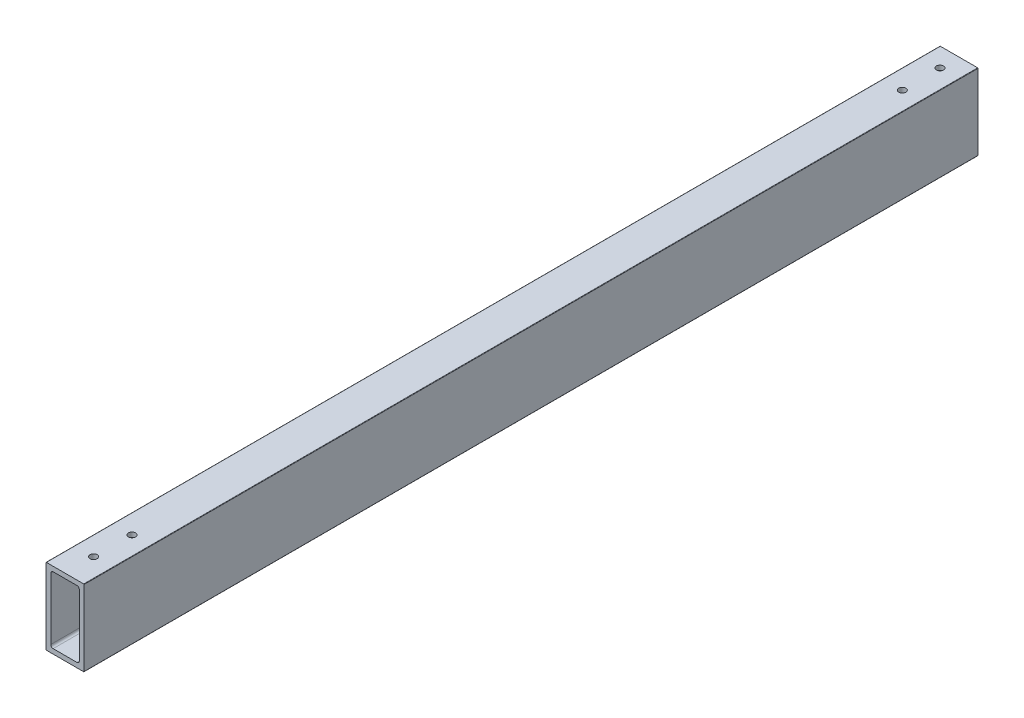
ISO-10303-21;
HEADER;
FILE_DESCRIPTION(('STEP AP214'),'2;1');
FILE_NAME('part.step','',(''),(''),'','','');
FILE_SCHEMA(('AUTOMOTIVE_DESIGN { 1 0 10303 214 1 1 1 1 }'));
ENDSEC;
DATA;
#1=APPLICATION_CONTEXT('core data for automotive mechanical design processes');
#2=APPLICATION_PROTOCOL_DEFINITION('international standard','automotive_design',2000,#1);
#3=PRODUCT_CONTEXT('',#1,'mechanical');
#4=PRODUCT('Part','Part','',(#3));
#5=PRODUCT_RELATED_PRODUCT_CATEGORY('part','',(#4));
#6=PRODUCT_DEFINITION_FORMATION('','',#4);
#7=PRODUCT_DEFINITION_CONTEXT('part definition',#1,'design');
#8=PRODUCT_DEFINITION('design','',#6,#7);
#9=PRODUCT_DEFINITION_SHAPE('','',#8);
#10=(LENGTH_UNIT() NAMED_UNIT(*) SI_UNIT(.MILLI.,.METRE.));
#11=(NAMED_UNIT(*) PLANE_ANGLE_UNIT() SI_UNIT($,.RADIAN.));
#12=(NAMED_UNIT(*) SI_UNIT($,.STERADIAN.) SOLID_ANGLE_UNIT());
#13=UNCERTAINTY_MEASURE_WITH_UNIT(LENGTH_MEASURE(1.E-05),#10,'distance_accuracy_value','');
#14=(GEOMETRIC_REPRESENTATION_CONTEXT(3) GLOBAL_UNCERTAINTY_ASSIGNED_CONTEXT((#13)) GLOBAL_UNIT_ASSIGNED_CONTEXT((#10,
#11,#12)) REPRESENTATION_CONTEXT('',''));
#15=CARTESIAN_POINT('',(0.,0.,0.));
#16=DIRECTION('',(0.,0.,1.));
#17=DIRECTION('',(1.,0.,0.));
#18=AXIS2_PLACEMENT_3D('',#15,#16,#17);
#19=CARTESIAN_POINT('',(3.175,4.7625,1828.8));
#20=DIRECTION('',(1.,0.,0.));
#21=DIRECTION('',(0.,1.,0.));
#22=AXIS2_PLACEMENT_3D('',#19,#20,#21);
#23=PLANE('',#22);
#24=DIRECTION('',(0.,0.,-1.));
#25=VECTOR('',#24,1.);
#26=CARTESIAN_POINT('',(3.175,4.7625,1828.8));
#27=LINE('',#26,#25);
#28=CARTESIAN_POINT('',(3.175,4.7625,603.25));
#29=VERTEX_POINT('',#28);
#30=CARTESIAN_POINT('',(3.175,4.7625,6.35000000000008));
#31=VERTEX_POINT('',#30);
#32=EDGE_CURVE('E184',#29,#31,#27,.T.);
#33=ORIENTED_EDGE('',*,*,#32,.T.);
#34=DIRECTION('',(0.,1.,0.));
#35=VECTOR('',#34,1.);
#36=CARTESIAN_POINT('',(3.175,4.7625,6.35000000000008));
#37=LINE('',#36,#35);
#38=CARTESIAN_POINT('',(3.175,46.0375,6.35000000000008));
#39=VERTEX_POINT('',#38);
#40=EDGE_CURVE('E57',#31,#39,#37,.T.);
#41=ORIENTED_EDGE('',*,*,#40,.T.);
#42=DIRECTION('',(0.,0.,-1.));
#43=VECTOR('',#42,1.);
#44=CARTESIAN_POINT('',(3.175,46.0375,1828.8));
#45=LINE('',#44,#43);
#46=CARTESIAN_POINT('',(3.175,46.0375,603.25));
#47=VERTEX_POINT('',#46);
#48=EDGE_CURVE('E198',#47,#39,#45,.T.);
#49=ORIENTED_EDGE('',*,*,#48,.F.);
#50=DIRECTION('',(0.,-1.,0.));
#51=VECTOR('',#50,1.);
#52=CARTESIAN_POINT('',(3.175,4.7625,603.25));
#53=LINE('',#52,#51);
#54=EDGE_CURVE('E178',#47,#29,#53,.T.);
#55=ORIENTED_EDGE('',*,*,#54,.T.);
#56=EDGE_LOOP('',(#33,#41,#49,#55));
#57=FACE_BOUND('',#56,.T.);
#58=ADVANCED_FACE('F42',(#57),#23,.T.);
#59=CARTESIAN_POINT('',(4.7625,46.0375,1828.8));
#60=DIRECTION('',(0.,0.,-1.));
#61=DIRECTION('',(-1.,0.,0.));
#62=AXIS2_PLACEMENT_3D('',#59,#60,#61);
#63=CYLINDRICAL_SURFACE('',#62,1.5875);
#64=CARTESIAN_POINT('',(4.7625,46.0375,6.35000000000008));
#65=DIRECTION('',(0.,0.,-1.));
#66=DIRECTION('',(-1.,0.,0.));
#67=AXIS2_PLACEMENT_3D('',#64,#65,#66);
#68=CIRCLE('',#67,1.5875);
#69=CARTESIAN_POINT('',(4.7625,47.625,6.35000000000008));
#70=VERTEX_POINT('',#69);
#71=EDGE_CURVE('E239',#70,#39,#68,.F.);
#72=ORIENTED_EDGE('',*,*,#71,.F.);
#73=DIRECTION('',(0.,0.,-1.));
#74=VECTOR('',#73,1.);
#75=CARTESIAN_POINT('',(4.7625,47.625,1828.8));
#76=LINE('',#75,#74);
#77=CARTESIAN_POINT('',(4.7625,47.625,603.25));
#78=VERTEX_POINT('',#77);
#79=EDGE_CURVE('E193',#78,#70,#76,.T.);
#80=ORIENTED_EDGE('',*,*,#79,.F.);
#81=CARTESIAN_POINT('',(4.7625,46.0375,603.25));
#82=DIRECTION('',(0.,0.,1.));
#83=DIRECTION('',(1.,0.,0.));
#84=AXIS2_PLACEMENT_3D('',#81,#82,#83);
#85=CIRCLE('',#84,1.5875);
#86=EDGE_CURVE('E300',#47,#78,#85,.F.);
#87=ORIENTED_EDGE('',*,*,#86,.F.);
#88=ORIENTED_EDGE('',*,*,#48,.T.);
#89=EDGE_LOOP('',(#72,#80,#87,#88));
#90=FACE_BOUND('',#89,.T.);
#91=ADVANCED_FACE('F325',(#90),#63,.F.);
#92=CARTESIAN_POINT('',(4.7625,47.625,1828.8));
#93=DIRECTION('',(0.,-1.,0.));
#94=DIRECTION('',(0.,0.,-1.));
#95=AXIS2_PLACEMENT_3D('',#92,#93,#94);
#96=PLANE('',#95);
#97=CARTESIAN_POINT('',(12.7,47.625,584.2));
#98=DIRECTION('',(0.,-1.,0.));
#99=DIRECTION('',(0.,0.,-1.));
#100=AXIS2_PLACEMENT_3D('',#97,#98,#99);
#101=CIRCLE('',#100,2.38125000000002);
#102=CARTESIAN_POINT('',(12.7,47.625,581.81875));
#103=VERTEX_POINT('',#102);
#104=EDGE_CURVE('E268',#103,#103,#101,.T.);
#105=ORIENTED_EDGE('',*,*,#104,.F.);
#106=EDGE_LOOP('',(#105));
#107=FACE_BOUND('',#106,.T.);
#108=CARTESIAN_POINT('',(12.954,47.625,558.8));
#109=DIRECTION('',(0.,-1.,0.));
#110=DIRECTION('',(0.,0.,-1.));
#111=AXIS2_PLACEMENT_3D('',#108,#109,#110);
#112=CIRCLE('',#111,2.38125000000002);
#113=CARTESIAN_POINT('',(12.954,47.625,556.41875));
#114=VERTEX_POINT('',#113);
#115=EDGE_CURVE('E265',#114,#114,#112,.T.);
#116=ORIENTED_EDGE('',*,*,#115,.F.);
#117=EDGE_LOOP('',(#116));
#118=FACE_BOUND('',#117,.T.);
#119=CARTESIAN_POINT('',(12.9539999999999,47.625,44.45));
#120=DIRECTION('',(0.,-1.,0.));
#121=DIRECTION('',(0.,0.,-1.));
#122=AXIS2_PLACEMENT_3D('',#119,#120,#121);
#123=CIRCLE('',#122,2.38125);
#124=CARTESIAN_POINT('',(12.9539999999999,47.625,42.06875));
#125=VERTEX_POINT('',#124);
#126=EDGE_CURVE('E262',#125,#125,#123,.T.);
#127=ORIENTED_EDGE('',*,*,#126,.F.);
#128=EDGE_LOOP('',(#127));
#129=FACE_BOUND('',#128,.T.);
#130=CARTESIAN_POINT('',(12.6999999999999,47.625,19.05));
#131=DIRECTION('',(0.,-1.,0.));
#132=DIRECTION('',(0.,0.,-1.));
#133=AXIS2_PLACEMENT_3D('',#130,#131,#132);
#134=CIRCLE('',#133,2.38125);
#135=CARTESIAN_POINT('',(12.6999999999999,47.625,16.66875));
#136=VERTEX_POINT('',#135);
#137=EDGE_CURVE('E251',#136,#136,#134,.T.);
#138=ORIENTED_EDGE('',*,*,#137,.F.);
#139=EDGE_LOOP('',(#138));
#140=FACE_BOUND('',#139,.T.);
#141=ORIENTED_EDGE('',*,*,#79,.T.);
#142=DIRECTION('',(1.,0.,0.));
#143=VECTOR('',#142,1.);
#144=CARTESIAN_POINT('',(4.7625,47.625,6.35000000000008));
#145=LINE('',#144,#143);
#146=CARTESIAN_POINT('',(20.6375,47.625,6.35000000000008));
#147=VERTEX_POINT('',#146);
#148=EDGE_CURVE('E237',#70,#147,#145,.T.);
#149=ORIENTED_EDGE('',*,*,#148,.T.);
#150=DIRECTION('',(0.,0.,-1.));
#151=VECTOR('',#150,1.);
#152=CARTESIAN_POINT('',(20.6375,47.625,1828.8));
#153=LINE('',#152,#151);
#154=CARTESIAN_POINT('',(20.6375,47.625,603.25));
#155=VERTEX_POINT('',#154);
#156=EDGE_CURVE('E190',#155,#147,#153,.T.);
#157=ORIENTED_EDGE('',*,*,#156,.F.);
#158=DIRECTION('',(-1.,0.,0.));
#159=VECTOR('',#158,1.);
#160=CARTESIAN_POINT('',(4.7625,47.625,603.25));
#161=LINE('',#160,#159);
#162=EDGE_CURVE('E297',#155,#78,#161,.T.);
#163=ORIENTED_EDGE('',*,*,#162,.T.);
#164=EDGE_LOOP('',(#141,#149,#157,#163));
#165=FACE_BOUND('',#164,.T.);
#166=ADVANCED_FACE('F324',(#107,#118,#129,#140,#165),#96,.T.);
#167=CARTESIAN_POINT('',(20.6375,46.0375,1828.8));
#168=DIRECTION('',(0.,0.,-1.));
#169=DIRECTION('',(-1.,0.,0.));
#170=AXIS2_PLACEMENT_3D('',#167,#168,#169);
#171=CYLINDRICAL_SURFACE('',#170,1.5875);
#172=CARTESIAN_POINT('',(20.6375,46.0375,6.35000000000008));
#173=DIRECTION('',(0.,0.,-1.));
#174=DIRECTION('',(-1.,0.,0.));
#175=AXIS2_PLACEMENT_3D('',#172,#173,#174);
#176=CIRCLE('',#175,1.5875);
#177=CARTESIAN_POINT('',(22.225,46.0375,6.35000000000008));
#178=VERTEX_POINT('',#177);
#179=EDGE_CURVE('E235',#178,#147,#176,.F.);
#180=ORIENTED_EDGE('',*,*,#179,.F.);
#181=DIRECTION('',(0.,0.,-1.));
#182=VECTOR('',#181,1.);
#183=CARTESIAN_POINT('',(22.225,46.0375,1828.8));
#184=LINE('',#183,#182);
#185=CARTESIAN_POINT('',(22.225,46.0375,603.25));
#186=VERTEX_POINT('',#185);
#187=EDGE_CURVE('E182',#186,#178,#184,.T.);
#188=ORIENTED_EDGE('',*,*,#187,.F.);
#189=CARTESIAN_POINT('',(20.6375,46.0375,603.25));
#190=DIRECTION('',(0.,0.,1.));
#191=DIRECTION('',(1.,0.,0.));
#192=AXIS2_PLACEMENT_3D('',#189,#190,#191);
#193=CIRCLE('',#192,1.5875);
#194=EDGE_CURVE('E233',#155,#186,#193,.F.);
#195=ORIENTED_EDGE('',*,*,#194,.F.);
#196=ORIENTED_EDGE('',*,*,#156,.T.);
#197=EDGE_LOOP('',(#180,#188,#195,#196));
#198=FACE_BOUND('',#197,.T.);
#199=ADVANCED_FACE('F232',(#198),#171,.F.);
#200=CARTESIAN_POINT('',(22.225,4.7625,1828.8));
#201=DIRECTION('',(-1.,0.,0.));
#202=DIRECTION('',(0.,0.,1.));
#203=AXIS2_PLACEMENT_3D('',#200,#201,#202);
#204=PLANE('',#203);
#205=ORIENTED_EDGE('',*,*,#187,.T.);
#206=DIRECTION('',(0.,-1.,0.));
#207=VECTOR('',#206,1.);
#208=CARTESIAN_POINT('',(22.225,4.7625,6.35000000000008));
#209=LINE('',#208,#207);
#210=CARTESIAN_POINT('',(22.225,4.7625,6.35000000000008));
#211=VERTEX_POINT('',#210);
#212=EDGE_CURVE('E227',#178,#211,#209,.T.);
#213=ORIENTED_EDGE('',*,*,#212,.T.);
#214=DIRECTION('',(0.,0.,-1.));
#215=VECTOR('',#214,1.);
#216=CARTESIAN_POINT('',(22.225,4.7625,1828.8));
#217=LINE('',#216,#215);
#218=CARTESIAN_POINT('',(22.225,4.7625,603.25));
#219=VERTEX_POINT('',#218);
#220=EDGE_CURVE('E216',#219,#211,#217,.T.);
#221=ORIENTED_EDGE('',*,*,#220,.F.);
#222=DIRECTION('',(0.,1.,0.));
#223=VECTOR('',#222,1.);
#224=CARTESIAN_POINT('',(22.225,4.7625,603.25));
#225=LINE('',#224,#223);
#226=EDGE_CURVE('E228',#219,#186,#225,.T.);
#227=ORIENTED_EDGE('',*,*,#226,.T.);
#228=EDGE_LOOP('',(#205,#213,#221,#227));
#229=FACE_BOUND('',#228,.T.);
#230=ADVANCED_FACE('F44',(#229),#204,.T.);
#231=CARTESIAN_POINT('',(20.6375,4.7625,1828.8));
#232=DIRECTION('',(0.,0.,-1.));
#233=DIRECTION('',(-1.,0.,0.));
#234=AXIS2_PLACEMENT_3D('',#231,#232,#233);
#235=CYLINDRICAL_SURFACE('',#234,1.5875);
#236=CARTESIAN_POINT('',(20.6375,4.7625,6.35000000000008));
#237=DIRECTION('',(0.,0.,-1.));
#238=DIRECTION('',(-1.,0.,0.));
#239=AXIS2_PLACEMENT_3D('',#236,#237,#238);
#240=CIRCLE('',#239,1.5875);
#241=CARTESIAN_POINT('',(20.6375,3.175,6.35000000000008));
#242=VERTEX_POINT('',#241);
#243=EDGE_CURVE('E241',#242,#211,#240,.F.);
#244=ORIENTED_EDGE('',*,*,#243,.F.);
#245=DIRECTION('',(0.,0.,-1.));
#246=VECTOR('',#245,1.);
#247=CARTESIAN_POINT('',(20.6375,3.175,1828.8));
#248=LINE('',#247,#246);
#249=CARTESIAN_POINT('',(20.6375,3.175,603.25));
#250=VERTEX_POINT('',#249);
#251=EDGE_CURVE('E214',#250,#242,#248,.T.);
#252=ORIENTED_EDGE('',*,*,#251,.F.);
#253=CARTESIAN_POINT('',(20.6375,4.7625,603.25));
#254=DIRECTION('',(0.,0.,1.));
#255=DIRECTION('',(1.,0.,0.));
#256=AXIS2_PLACEMENT_3D('',#253,#254,#255);
#257=CIRCLE('',#256,1.5875);
#258=EDGE_CURVE('E293',#219,#250,#257,.F.);
#259=ORIENTED_EDGE('',*,*,#258,.F.);
#260=ORIENTED_EDGE('',*,*,#220,.T.);
#261=EDGE_LOOP('',(#244,#252,#259,#260));
#262=FACE_BOUND('',#261,.T.);
#263=ADVANCED_FACE('F316',(#262),#235,.F.);
#264=CARTESIAN_POINT('',(4.7625,3.175,1828.8));
#265=DIRECTION('',(0.,1.,0.));
#266=DIRECTION('',(1.,0.,0.));
#267=AXIS2_PLACEMENT_3D('',#264,#265,#266);
#268=PLANE('',#267);
#269=ORIENTED_EDGE('',*,*,#251,.T.);
#270=DIRECTION('',(-1.,0.,0.));
#271=VECTOR('',#270,1.);
#272=CARTESIAN_POINT('',(4.7625,3.175,6.35000000000008));
#273=LINE('',#272,#271);
#274=CARTESIAN_POINT('',(4.7625,3.175,6.35000000000008));
#275=VERTEX_POINT('',#274);
#276=EDGE_CURVE('E311',#242,#275,#273,.T.);
#277=ORIENTED_EDGE('',*,*,#276,.T.);
#278=DIRECTION('',(0.,0.,-1.));
#279=VECTOR('',#278,1.);
#280=CARTESIAN_POINT('',(4.7625,3.175,1828.8));
#281=LINE('',#280,#279);
#282=CARTESIAN_POINT('',(4.7625,3.175,603.25));
#283=VERTEX_POINT('',#282);
#284=EDGE_CURVE('E211',#283,#275,#281,.T.);
#285=ORIENTED_EDGE('',*,*,#284,.F.);
#286=DIRECTION('',(1.,0.,0.));
#287=VECTOR('',#286,1.);
#288=CARTESIAN_POINT('',(4.7625,3.175,603.25));
#289=LINE('',#288,#287);
#290=EDGE_CURVE('E290',#283,#250,#289,.T.);
#291=ORIENTED_EDGE('',*,*,#290,.T.);
#292=EDGE_LOOP('',(#269,#277,#285,#291));
#293=FACE_BOUND('',#292,.T.);
#294=ADVANCED_FACE('F318',(#293),#268,.T.);
#295=CARTESIAN_POINT('',(4.7625,4.7625,1828.8));
#296=DIRECTION('',(0.,0.,-1.));
#297=DIRECTION('',(-1.,0.,0.));
#298=AXIS2_PLACEMENT_3D('',#295,#296,#297);
#299=CYLINDRICAL_SURFACE('',#298,1.5875);
#300=CARTESIAN_POINT('',(4.7625,4.7625,6.35000000000008));
#301=DIRECTION('',(0.,0.,-1.));
#302=DIRECTION('',(-1.,0.,0.));
#303=AXIS2_PLACEMENT_3D('',#300,#301,#302);
#304=CIRCLE('',#303,1.5875);
#305=EDGE_CURVE('E167',#31,#275,#304,.F.);
#306=ORIENTED_EDGE('',*,*,#305,.F.);
#307=ORIENTED_EDGE('',*,*,#32,.F.);
#308=CARTESIAN_POINT('',(4.7625,4.7625,603.25));
#309=DIRECTION('',(0.,0.,1.));
#310=DIRECTION('',(1.,0.,0.));
#311=AXIS2_PLACEMENT_3D('',#308,#309,#310);
#312=CIRCLE('',#311,1.5875);
#313=EDGE_CURVE('E288',#283,#29,#312,.F.);
#314=ORIENTED_EDGE('',*,*,#313,.F.);
#315=ORIENTED_EDGE('',*,*,#284,.T.);
#316=EDGE_LOOP('',(#306,#307,#314,#315));
#317=FACE_BOUND('',#316,.T.);
#318=ADVANCED_FACE('F308',(#317),#299,.F.);
#319=CARTESIAN_POINT('',(0.,0.254,1828.8));
#320=DIRECTION('',(1.,0.,0.));
#321=DIRECTION('',(0.,1.,0.));
#322=AXIS2_PLACEMENT_3D('',#319,#320,#321);
#323=PLANE('',#322);
#324=DIRECTION('',(0.,1.,0.));
#325=VECTOR('',#324,1.);
#326=CARTESIAN_POINT('',(0.,0.254,6.35000000000008));
#327=LINE('',#326,#325);
#328=CARTESIAN_POINT('',(0.,0.254,6.35000000000008));
#329=VERTEX_POINT('',#328);
#330=CARTESIAN_POINT('',(0.,50.546,6.35000000000008));
#331=VERTEX_POINT('',#330);
#332=EDGE_CURVE('E153',#329,#331,#327,.T.);
#333=ORIENTED_EDGE('',*,*,#332,.F.);
#334=DIRECTION('',(0.,0.,-1.));
#335=VECTOR('',#334,1.);
#336=CARTESIAN_POINT('',(0.,0.254,1828.8));
#337=LINE('',#336,#335);
#338=CARTESIAN_POINT('',(0.,0.254,603.25));
#339=VERTEX_POINT('',#338);
#340=EDGE_CURVE('E164',#339,#329,#337,.T.);
#341=ORIENTED_EDGE('',*,*,#340,.F.);
#342=DIRECTION('',(0.,-1.,0.));
#343=VECTOR('',#342,1.);
#344=CARTESIAN_POINT('',(0.,0.254,603.25));
#345=LINE('',#344,#343);
#346=CARTESIAN_POINT('',(0.,50.546,603.25));
#347=VERTEX_POINT('',#346);
#348=EDGE_CURVE('E286',#347,#339,#345,.T.);
#349=ORIENTED_EDGE('',*,*,#348,.F.);
#350=DIRECTION('',(0.,0.,-1.));
#351=VECTOR('',#350,1.);
#352=CARTESIAN_POINT('',(0.,50.546,1828.8));
#353=LINE('',#352,#351);
#354=EDGE_CURVE('E166',#347,#331,#353,.T.);
#355=ORIENTED_EDGE('',*,*,#354,.T.);
#356=EDGE_LOOP('',(#333,#341,#349,#355));
#357=FACE_BOUND('',#356,.T.);
#358=ADVANCED_FACE('F162',(#357),#323,.F.);
#359=CARTESIAN_POINT('',(0.254,50.546,1828.8));
#360=DIRECTION('',(0.,0.,-1.));
#361=DIRECTION('',(-1.,0.,0.));
#362=AXIS2_PLACEMENT_3D('',#359,#360,#361);
#363=CYLINDRICAL_SURFACE('',#362,0.253999999999995);
#364=DIRECTION('',(0.,0.,-1.));
#365=VECTOR('',#364,1.);
#366=CARTESIAN_POINT('',(0.254,50.8,1828.8));
#367=LINE('',#366,#365);
#368=CARTESIAN_POINT('',(0.254,50.8,603.25));
#369=VERTEX_POINT('',#368);
#370=CARTESIAN_POINT('',(0.254,50.8,6.35000000000008));
#371=VERTEX_POINT('',#370);
#372=EDGE_CURVE('E185',#369,#371,#367,.T.);
#373=ORIENTED_EDGE('',*,*,#372,.T.);
#374=CARTESIAN_POINT('',(0.254,50.546,6.35000000000008));
#375=DIRECTION('',(0.,0.,-1.));
#376=DIRECTION('',(-1.,0.,0.));
#377=AXIS2_PLACEMENT_3D('',#374,#375,#376);
#378=CIRCLE('',#377,0.253999999999995);
#379=EDGE_CURVE('E168',#371,#331,#378,.F.);
#380=ORIENTED_EDGE('',*,*,#379,.T.);
#381=ORIENTED_EDGE('',*,*,#354,.F.);
#382=CARTESIAN_POINT('',(0.254,50.546,603.25));
#383=DIRECTION('',(0.,0.,1.));
#384=DIRECTION('',(1.,0.,0.));
#385=AXIS2_PLACEMENT_3D('',#382,#383,#384);
#386=CIRCLE('',#385,0.253999999999995);
#387=EDGE_CURVE('E283',#347,#369,#386,.F.);
#388=ORIENTED_EDGE('',*,*,#387,.T.);
#389=EDGE_LOOP('',(#373,#380,#381,#388));
#390=FACE_BOUND('',#389,.T.);
#391=ADVANCED_FACE('F344',(#390),#363,.T.);
#392=CARTESIAN_POINT('',(0.254,50.8,1828.8));
#393=DIRECTION('',(0.,-1.,0.));
#394=DIRECTION('',(0.,0.,-1.));
#395=AXIS2_PLACEMENT_3D('',#392,#393,#394);
#396=PLANE('',#395);
#397=CARTESIAN_POINT('',(12.6999999999999,50.8,19.05));
#398=DIRECTION('',(0.,1.,0.));
#399=DIRECTION('',(0.,0.,-1.));
#400=AXIS2_PLACEMENT_3D('',#397,#398,#399);
#401=CIRCLE('',#400,2.38125);
#402=CARTESIAN_POINT('',(12.6999999999999,50.8,16.66875));
#403=VERTEX_POINT('',#402);
#404=EDGE_CURVE('E247',#403,#403,#401,.T.);
#405=ORIENTED_EDGE('',*,*,#404,.F.);
#406=EDGE_LOOP('',(#405));
#407=FACE_BOUND('',#406,.T.);
#408=CARTESIAN_POINT('',(12.9539999999999,50.8,44.45));
#409=DIRECTION('',(0.,1.,0.));
#410=DIRECTION('',(0.,0.,-1.));
#411=AXIS2_PLACEMENT_3D('',#408,#409,#410);
#412=CIRCLE('',#411,2.38125);
#413=CARTESIAN_POINT('',(12.9539999999999,50.8,42.06875));
#414=VERTEX_POINT('',#413);
#415=EDGE_CURVE('E255',#414,#414,#412,.T.);
#416=ORIENTED_EDGE('',*,*,#415,.F.);
#417=EDGE_LOOP('',(#416));
#418=FACE_BOUND('',#417,.T.);
#419=CARTESIAN_POINT('',(12.954,50.8,558.8));
#420=DIRECTION('',(0.,1.,0.));
#421=DIRECTION('',(0.,0.,1.));
#422=AXIS2_PLACEMENT_3D('',#419,#420,#421);
#423=CIRCLE('',#422,2.38125000000002);
#424=CARTESIAN_POINT('',(12.954,50.8,561.18125));
#425=VERTEX_POINT('',#424);
#426=EDGE_CURVE('E252',#425,#425,#423,.T.);
#427=ORIENTED_EDGE('',*,*,#426,.F.);
#428=EDGE_LOOP('',(#427));
#429=FACE_BOUND('',#428,.T.);
#430=CARTESIAN_POINT('',(12.7,50.8,584.2));
#431=DIRECTION('',(0.,1.,0.));
#432=DIRECTION('',(0.,0.,1.));
#433=AXIS2_PLACEMENT_3D('',#430,#431,#432);
#434=CIRCLE('',#433,2.38125000000002);
#435=CARTESIAN_POINT('',(12.7,50.8,586.58125));
#436=VERTEX_POINT('',#435);
#437=EDGE_CURVE('E248',#436,#436,#434,.T.);
#438=ORIENTED_EDGE('',*,*,#437,.F.);
#439=EDGE_LOOP('',(#438));
#440=FACE_BOUND('',#439,.T.);
#441=DIRECTION('',(1.,0.,0.));
#442=VECTOR('',#441,1.);
#443=CARTESIAN_POINT('',(0.254,50.8,6.35000000000008));
#444=LINE('',#443,#442);
#445=CARTESIAN_POINT('',(25.146,50.8,6.35000000000008));
#446=VERTEX_POINT('',#445);
#447=EDGE_CURVE('E365',#371,#446,#444,.T.);
#448=ORIENTED_EDGE('',*,*,#447,.F.);
#449=ORIENTED_EDGE('',*,*,#372,.F.);
#450=DIRECTION('',(-1.,0.,0.));
#451=VECTOR('',#450,1.);
#452=CARTESIAN_POINT('',(0.254,50.8,603.25));
#453=LINE('',#452,#451);
#454=CARTESIAN_POINT('',(25.146,50.8,603.25));
#455=VERTEX_POINT('',#454);
#456=EDGE_CURVE('E281',#455,#369,#453,.T.);
#457=ORIENTED_EDGE('',*,*,#456,.F.);
#458=DIRECTION('',(0.,0.,-1.));
#459=VECTOR('',#458,1.);
#460=CARTESIAN_POINT('',(25.146,50.8,1828.8));
#461=LINE('',#460,#459);
#462=EDGE_CURVE('E189',#455,#446,#461,.T.);
#463=ORIENTED_EDGE('',*,*,#462,.T.);
#464=EDGE_LOOP('',(#448,#449,#457,#463));
#465=FACE_BOUND('',#464,.T.);
#466=ADVANCED_FACE('F346',(#407,#418,#429,#440,#465),#396,.F.);
#467=CARTESIAN_POINT('',(25.146,50.546,1828.8));
#468=DIRECTION('',(0.,0.,-1.));
#469=DIRECTION('',(-1.,0.,0.));
#470=AXIS2_PLACEMENT_3D('',#467,#468,#469);
#471=CYLINDRICAL_SURFACE('',#470,0.253999999999994);
#472=DIRECTION('',(0.,0.,-1.));
#473=VECTOR('',#472,1.);
#474=CARTESIAN_POINT('',(25.4,50.546,1828.8));
#475=LINE('',#474,#473);
#476=CARTESIAN_POINT('',(25.4,50.546,603.25));
#477=VERTEX_POINT('',#476);
#478=CARTESIAN_POINT('',(25.4,50.546,6.35000000000008));
#479=VERTEX_POINT('',#478);
#480=EDGE_CURVE('E194',#477,#479,#475,.T.);
#481=ORIENTED_EDGE('',*,*,#480,.T.);
#482=CARTESIAN_POINT('',(25.146,50.546,6.35000000000008));
#483=DIRECTION('',(0.,0.,-1.));
#484=DIRECTION('',(-1.,0.,0.));
#485=AXIS2_PLACEMENT_3D('',#482,#483,#484);
#486=CIRCLE('',#485,0.253999999999994);
#487=EDGE_CURVE('E369',#479,#446,#486,.F.);
#488=ORIENTED_EDGE('',*,*,#487,.T.);
#489=ORIENTED_EDGE('',*,*,#462,.F.);
#490=CARTESIAN_POINT('',(25.146,50.546,603.25));
#491=DIRECTION('',(0.,0.,1.));
#492=DIRECTION('',(1.,0.,0.));
#493=AXIS2_PLACEMENT_3D('',#490,#491,#492);
#494=CIRCLE('',#493,0.253999999999994);
#495=EDGE_CURVE('E278',#455,#477,#494,.F.);
#496=ORIENTED_EDGE('',*,*,#495,.T.);
#497=EDGE_LOOP('',(#481,#488,#489,#496));
#498=FACE_BOUND('',#497,.T.);
#499=ADVANCED_FACE('F349',(#498),#471,.T.);
#500=CARTESIAN_POINT('',(25.4,0.254,1828.8));
#501=DIRECTION('',(-1.,0.,0.));
#502=DIRECTION('',(0.,0.,1.));
#503=AXIS2_PLACEMENT_3D('',#500,#501,#502);
#504=PLANE('',#503);
#505=DIRECTION('',(0.,-1.,0.));
#506=VECTOR('',#505,1.);
#507=CARTESIAN_POINT('',(25.4,0.254,6.35000000000008));
#508=LINE('',#507,#506);
#509=CARTESIAN_POINT('',(25.4,0.254,6.35000000000008));
#510=VERTEX_POINT('',#509);
#511=EDGE_CURVE('E373',#479,#510,#508,.T.);
#512=ORIENTED_EDGE('',*,*,#511,.F.);
#513=ORIENTED_EDGE('',*,*,#480,.F.);
#514=DIRECTION('',(0.,1.,0.));
#515=VECTOR('',#514,1.);
#516=CARTESIAN_POINT('',(25.4,0.254,603.25));
#517=LINE('',#516,#515);
#518=CARTESIAN_POINT('',(25.4,0.254,603.25));
#519=VERTEX_POINT('',#518);
#520=EDGE_CURVE('E276',#519,#477,#517,.T.);
#521=ORIENTED_EDGE('',*,*,#520,.F.);
#522=DIRECTION('',(0.,0.,-1.));
#523=VECTOR('',#522,1.);
#524=CARTESIAN_POINT('',(25.4,0.254,1828.8));
#525=LINE('',#524,#523);
#526=EDGE_CURVE('E176',#519,#510,#525,.T.);
#527=ORIENTED_EDGE('',*,*,#526,.T.);
#528=EDGE_LOOP('',(#512,#513,#521,#527));
#529=FACE_BOUND('',#528,.T.);
#530=ADVANCED_FACE('F342',(#529),#504,.F.);
#531=CARTESIAN_POINT('',(25.146,0.254,1828.8));
#532=DIRECTION('',(0.,0.,-1.));
#533=DIRECTION('',(-1.,0.,0.));
#534=AXIS2_PLACEMENT_3D('',#531,#532,#533);
#535=CYLINDRICAL_SURFACE('',#534,0.254);
#536=DIRECTION('',(0.,0.,-1.));
#537=VECTOR('',#536,1.);
#538=CARTESIAN_POINT('',(25.146,0.,1828.8));
#539=LINE('',#538,#537);
#540=CARTESIAN_POINT('',(25.146,0.,603.25));
#541=VERTEX_POINT('',#540);
#542=CARTESIAN_POINT('',(25.146,0.,6.35000000000008));
#543=VERTEX_POINT('',#542);
#544=EDGE_CURVE('E172',#541,#543,#539,.T.);
#545=ORIENTED_EDGE('',*,*,#544,.T.);
#546=CARTESIAN_POINT('',(25.146,0.254,6.35000000000008));
#547=DIRECTION('',(0.,0.,-1.));
#548=DIRECTION('',(-1.,0.,0.));
#549=AXIS2_PLACEMENT_3D('',#546,#547,#548);
#550=CIRCLE('',#549,0.254);
#551=EDGE_CURVE('E375',#543,#510,#550,.F.);
#552=ORIENTED_EDGE('',*,*,#551,.T.);
#553=ORIENTED_EDGE('',*,*,#526,.F.);
#554=CARTESIAN_POINT('',(25.146,0.254,603.25));
#555=DIRECTION('',(0.,0.,1.));
#556=DIRECTION('',(1.,0.,0.));
#557=AXIS2_PLACEMENT_3D('',#554,#555,#556);
#558=CIRCLE('',#557,0.254);
#559=EDGE_CURVE('E273',#519,#541,#558,.F.);
#560=ORIENTED_EDGE('',*,*,#559,.T.);
#561=EDGE_LOOP('',(#545,#552,#553,#560));
#562=FACE_BOUND('',#561,.T.);
#563=ADVANCED_FACE('F338',(#562),#535,.T.);
#564=CARTESIAN_POINT('',(0.254,0.,1828.8));
#565=DIRECTION('',(0.,1.,0.));
#566=DIRECTION('',(1.,0.,0.));
#567=AXIS2_PLACEMENT_3D('',#564,#565,#566);
#568=PLANE('',#567);
#569=DIRECTION('',(-1.,0.,0.));
#570=VECTOR('',#569,1.);
#571=CARTESIAN_POINT('',(0.254,0.,6.35000000000008));
#572=LINE('',#571,#570);
#573=CARTESIAN_POINT('',(0.254,0.,6.35000000000008));
#574=VERTEX_POINT('',#573);
#575=EDGE_CURVE('E65',#543,#574,#572,.T.);
#576=ORIENTED_EDGE('',*,*,#575,.F.);
#577=ORIENTED_EDGE('',*,*,#544,.F.);
#578=DIRECTION('',(1.,0.,0.));
#579=VECTOR('',#578,1.);
#580=CARTESIAN_POINT('',(0.254,0.,603.25));
#581=LINE('',#580,#579);
#582=CARTESIAN_POINT('',(0.254,0.,603.25));
#583=VERTEX_POINT('',#582);
#584=EDGE_CURVE('E271',#583,#541,#581,.T.);
#585=ORIENTED_EDGE('',*,*,#584,.F.);
#586=DIRECTION('',(0.,0.,-1.));
#587=VECTOR('',#586,1.);
#588=CARTESIAN_POINT('',(0.254,0.,1828.8));
#589=LINE('',#588,#587);
#590=EDGE_CURVE('E173',#583,#574,#589,.T.);
#591=ORIENTED_EDGE('',*,*,#590,.T.);
#592=EDGE_LOOP('',(#576,#577,#585,#591));
#593=FACE_BOUND('',#592,.T.);
#594=ADVANCED_FACE('F341',(#593),#568,.F.);
#595=CARTESIAN_POINT('',(0.254,0.254,1828.8));
#596=DIRECTION('',(0.,0.,-1.));
#597=DIRECTION('',(-1.,0.,0.));
#598=AXIS2_PLACEMENT_3D('',#595,#596,#597);
#599=CYLINDRICAL_SURFACE('',#598,0.254);
#600=ORIENTED_EDGE('',*,*,#340,.T.);
#601=CARTESIAN_POINT('',(0.254,0.254,6.35000000000008));
#602=DIRECTION('',(0.,0.,-1.));
#603=DIRECTION('',(-1.,0.,0.));
#604=AXIS2_PLACEMENT_3D('',#601,#602,#603);
#605=CIRCLE('',#604,0.254);
#606=EDGE_CURVE('E11',#329,#574,#605,.F.);
#607=ORIENTED_EDGE('',*,*,#606,.T.);
#608=ORIENTED_EDGE('',*,*,#590,.F.);
#609=CARTESIAN_POINT('',(0.254,0.254,603.25));
#610=DIRECTION('',(0.,0.,1.));
#611=DIRECTION('',(1.,0.,0.));
#612=AXIS2_PLACEMENT_3D('',#609,#610,#611);
#613=CIRCLE('',#612,0.254);
#614=EDGE_CURVE('E50',#583,#339,#613,.F.);
#615=ORIENTED_EDGE('',*,*,#614,.T.);
#616=EDGE_LOOP('',(#600,#607,#608,#615));
#617=FACE_BOUND('',#616,.T.);
#618=ADVANCED_FACE('F171',(#617),#599,.T.);
#619=CARTESIAN_POINT('',(0.,0.,603.25));
#620=DIRECTION('',(0.,0.,1.));
#621=DIRECTION('',(1.,0.,0.));
#622=AXIS2_PLACEMENT_3D('',#619,#620,#621);
#623=PLANE('',#622);
#624=ORIENTED_EDGE('',*,*,#86,.T.);
#625=ORIENTED_EDGE('',*,*,#162,.F.);
#626=ORIENTED_EDGE('',*,*,#194,.T.);
#627=ORIENTED_EDGE('',*,*,#226,.F.);
#628=ORIENTED_EDGE('',*,*,#258,.T.);
#629=ORIENTED_EDGE('',*,*,#290,.F.);
#630=ORIENTED_EDGE('',*,*,#313,.T.);
#631=ORIENTED_EDGE('',*,*,#54,.F.);
#632=EDGE_LOOP('',(#624,#625,#626,#627,#628,#629,#630,#631));
#633=FACE_BOUND('',#632,.T.);
#634=ORIENTED_EDGE('',*,*,#348,.T.);
#635=ORIENTED_EDGE('',*,*,#614,.F.);
#636=ORIENTED_EDGE('',*,*,#584,.T.);
#637=ORIENTED_EDGE('',*,*,#559,.F.);
#638=ORIENTED_EDGE('',*,*,#520,.T.);
#639=ORIENTED_EDGE('',*,*,#495,.F.);
#640=ORIENTED_EDGE('',*,*,#456,.T.);
#641=ORIENTED_EDGE('',*,*,#387,.F.);
#642=EDGE_LOOP('',(#634,#635,#636,#637,#638,#639,#640,#641));
#643=FACE_BOUND('',#642,.T.);
#644=ADVANCED_FACE('F320',(#633,#643),#623,.T.);
#645=CARTESIAN_POINT('',(12.6999999999999,36.83,19.05));
#646=DIRECTION('',(0.,1.,0.));
#647=DIRECTION('',(0.,0.,1.));
#648=AXIS2_PLACEMENT_3D('',#645,#646,#647);
#649=CYLINDRICAL_SURFACE('',#648,2.38125);
#650=ORIENTED_EDGE('',*,*,#137,.T.);
#651=EDGE_LOOP('',(#650));
#652=FACE_BOUND('',#651,.T.);
#653=ORIENTED_EDGE('',*,*,#404,.T.);
#654=EDGE_LOOP('',(#653));
#655=FACE_BOUND('',#654,.T.);
#656=ADVANCED_FACE('F458',(#652,#655),#649,.F.);
#657=CARTESIAN_POINT('',(12.9539999999999,36.83,44.45));
#658=DIRECTION('',(0.,1.,0.));
#659=DIRECTION('',(0.,0.,1.));
#660=AXIS2_PLACEMENT_3D('',#657,#658,#659);
#661=CYLINDRICAL_SURFACE('',#660,2.38125);
#662=ORIENTED_EDGE('',*,*,#126,.T.);
#663=EDGE_LOOP('',(#662));
#664=FACE_BOUND('',#663,.T.);
#665=ORIENTED_EDGE('',*,*,#415,.T.);
#666=EDGE_LOOP('',(#665));
#667=FACE_BOUND('',#666,.T.);
#668=ADVANCED_FACE('F450',(#664,#667),#661,.F.);
#669=CARTESIAN_POINT('',(12.954,36.83,558.8));
#670=DIRECTION('',(0.,1.,0.));
#671=DIRECTION('',(0.,0.,1.));
#672=AXIS2_PLACEMENT_3D('',#669,#670,#671);
#673=CYLINDRICAL_SURFACE('',#672,2.38125000000002);
#674=ORIENTED_EDGE('',*,*,#115,.T.);
#675=EDGE_LOOP('',(#674));
#676=FACE_BOUND('',#675,.T.);
#677=ORIENTED_EDGE('',*,*,#426,.T.);
#678=EDGE_LOOP('',(#677));
#679=FACE_BOUND('',#678,.T.);
#680=ADVANCED_FACE('F442',(#676,#679),#673,.F.);
#681=CARTESIAN_POINT('',(12.7,36.83,584.2));
#682=DIRECTION('',(0.,1.,0.));
#683=DIRECTION('',(0.,0.,1.));
#684=AXIS2_PLACEMENT_3D('',#681,#682,#683);
#685=CYLINDRICAL_SURFACE('',#684,2.38125000000002);
#686=ORIENTED_EDGE('',*,*,#104,.T.);
#687=EDGE_LOOP('',(#686));
#688=FACE_BOUND('',#687,.T.);
#689=ORIENTED_EDGE('',*,*,#437,.T.);
#690=EDGE_LOOP('',(#689));
#691=FACE_BOUND('',#690,.T.);
#692=ADVANCED_FACE('F432',(#688,#691),#685,.F.);
#693=CARTESIAN_POINT('',(0.,0.,6.35));
#694=DIRECTION('',(0.,0.,-1.));
#695=DIRECTION('',(-1.,0.,0.));
#696=AXIS2_PLACEMENT_3D('',#693,#694,#695);
#697=PLANE('',#696);
#698=ORIENTED_EDGE('',*,*,#305,.T.);
#699=ORIENTED_EDGE('',*,*,#276,.F.);
#700=ORIENTED_EDGE('',*,*,#243,.T.);
#701=ORIENTED_EDGE('',*,*,#212,.F.);
#702=ORIENTED_EDGE('',*,*,#179,.T.);
#703=ORIENTED_EDGE('',*,*,#148,.F.);
#704=ORIENTED_EDGE('',*,*,#71,.T.);
#705=ORIENTED_EDGE('',*,*,#40,.F.);
#706=EDGE_LOOP('',(#698,#699,#700,#701,#702,#703,#704,#705));
#707=FACE_BOUND('',#706,.T.);
#708=ORIENTED_EDGE('',*,*,#332,.T.);
#709=ORIENTED_EDGE('',*,*,#379,.F.);
#710=ORIENTED_EDGE('',*,*,#447,.T.);
#711=ORIENTED_EDGE('',*,*,#487,.F.);
#712=ORIENTED_EDGE('',*,*,#511,.T.);
#713=ORIENTED_EDGE('',*,*,#551,.F.);
#714=ORIENTED_EDGE('',*,*,#575,.T.);
#715=ORIENTED_EDGE('',*,*,#606,.F.);
#716=EDGE_LOOP('',(#708,#709,#710,#711,#712,#713,#714,#715));
#717=FACE_BOUND('',#716,.T.);
#718=ADVANCED_FACE('F152',(#707,#717),#697,.T.);
#719=CLOSED_SHELL('',(#58,#91,#166,#199,#230,#263,#294,#318,#358,#391,#466,#499,#530,#563,#594,
#618,#644,#656,#668,#680,#692,#718));
#720=MANIFOLD_SOLID_BREP('B2',#719);
#721=ADVANCED_BREP_SHAPE_REPRESENTATION('',(#18,#720),#14);
#722=SHAPE_DEFINITION_REPRESENTATION(#9,#721);
ENDSEC;
END-ISO-10303-21;
